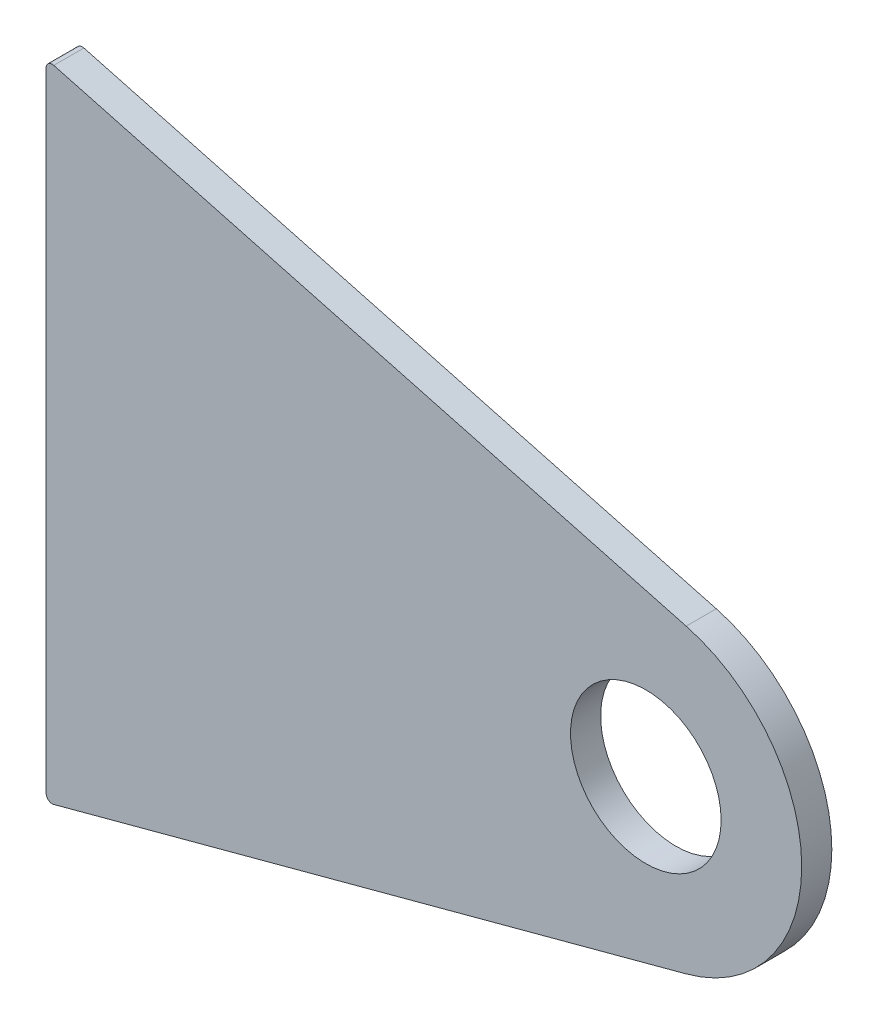
ISO-10303-21;
HEADER;
FILE_DESCRIPTION(('STEP AP214'),'2;1');
FILE_NAME('part.step','',(''),(''),'','','');
FILE_SCHEMA(('AUTOMOTIVE_DESIGN { 1 0 10303 214 1 1 1 1 }'));
ENDSEC;
DATA;
#1=APPLICATION_CONTEXT('core data for automotive mechanical design processes');
#2=APPLICATION_PROTOCOL_DEFINITION('international standard','automotive_design',2000,#1);
#3=PRODUCT_CONTEXT('',#1,'mechanical');
#4=PRODUCT('Part','Part','',(#3));
#5=PRODUCT_RELATED_PRODUCT_CATEGORY('part','',(#4));
#6=PRODUCT_DEFINITION_FORMATION('','',#4);
#7=PRODUCT_DEFINITION_CONTEXT('part definition',#1,'design');
#8=PRODUCT_DEFINITION('design','',#6,#7);
#9=PRODUCT_DEFINITION_SHAPE('','',#8);
#10=(LENGTH_UNIT() NAMED_UNIT(*) SI_UNIT(.MILLI.,.METRE.));
#11=(NAMED_UNIT(*) PLANE_ANGLE_UNIT() SI_UNIT($,.RADIAN.));
#12=(NAMED_UNIT(*) SI_UNIT($,.STERADIAN.) SOLID_ANGLE_UNIT());
#13=UNCERTAINTY_MEASURE_WITH_UNIT(LENGTH_MEASURE(1.E-05),#10,'distance_accuracy_value','');
#14=(GEOMETRIC_REPRESENTATION_CONTEXT(3) GLOBAL_UNCERTAINTY_ASSIGNED_CONTEXT((#13)) GLOBAL_UNIT_ASSIGNED_CONTEXT((#10,
#11,#12)) REPRESENTATION_CONTEXT('',''));
#15=CARTESIAN_POINT('',(0.,0.,0.));
#16=DIRECTION('',(0.,0.,1.));
#17=DIRECTION('',(1.,0.,0.));
#18=AXIS2_PLACEMENT_3D('',#15,#16,#17);
#19=CARTESIAN_POINT('',(13.3974596215562,49.9999999999999,10.));
#20=DIRECTION('',(-0.258819045102523,-0.965925826289068,0.));
#21=DIRECTION('',(0.965925826289068,-0.258819045102523,0.));
#22=AXIS2_PLACEMENT_3D('',#19,#20,#21);
#23=PLANE('',#22);
#24=DIRECTION('',(-0.965925826289068,0.258819045102523,0.));
#25=VECTOR('',#24,1.);
#26=CARTESIAN_POINT('',(13.3974596215562,49.9999999999999,0.));
#27=LINE('',#26,#25);
#28=CARTESIAN_POINT('',(13.3974596215558,50.,0.));
#29=VERTEX_POINT('',#28);
#30=CARTESIAN_POINT('',(-196.588584071834,106.265590829451,0.));
#31=VERTEX_POINT('',#30);
#32=EDGE_CURVE('E124',#29,#31,#27,.T.);
#33=ORIENTED_EDGE('',*,*,#32,.T.);
#34=DIRECTION('',(0.,0.,-1.));
#35=VECTOR('',#34,1.);
#36=CARTESIAN_POINT('',(-196.588584071834,106.265590829451,10.));
#37=LINE('',#36,#35);
#38=CARTESIAN_POINT('',(-196.588584071834,106.265590829451,10.));
#39=VERTEX_POINT('',#38);
#40=EDGE_CURVE('E11',#31,#39,#37,.F.);
#41=ORIENTED_EDGE('',*,*,#40,.T.);
#42=DIRECTION('',(-0.965925826289068,0.258819045102523,0.));
#43=VECTOR('',#42,1.);
#44=CARTESIAN_POINT('',(13.3974596215562,49.9999999999999,10.));
#45=LINE('',#44,#43);
#46=CARTESIAN_POINT('',(13.3974596215558,50.,10.));
#47=VERTEX_POINT('',#46);
#48=EDGE_CURVE('E143',#47,#39,#45,.T.);
#49=ORIENTED_EDGE('',*,*,#48,.F.);
#50=DIRECTION('',(0.,0.,-1.));
#51=VECTOR('',#50,1.);
#52=CARTESIAN_POINT('',(13.3974596215558,50.,10.));
#53=LINE('',#52,#51);
#54=EDGE_CURVE('E107',#47,#29,#53,.T.);
#55=ORIENTED_EDGE('',*,*,#54,.T.);
#56=EDGE_LOOP('',(#33,#41,#49,#55));
#57=FACE_BOUND('',#56,.T.);
#58=ADVANCED_FACE('F39',(#57),#23,.F.);
#59=CARTESIAN_POINT('',(-199.106222162039,0.,10.));
#60=DIRECTION('',(1.,0.,0.));
#61=DIRECTION('',(0.,1.,0.));
#62=AXIS2_PLACEMENT_3D('',#59,#60,#61);
#63=PLANE('',#62);
#64=DIRECTION('',(0.,-1.,0.));
#65=VECTOR('',#64,1.);
#66=CARTESIAN_POINT('',(-199.106222162039,0.,0.));
#67=LINE('',#66,#65);
#68=CARTESIAN_POINT('',(-199.106222162039,104.333739176873,0.));
#69=VERTEX_POINT('',#68);
#70=CARTESIAN_POINT('',(-199.106222162039,-104.333739176872,0.));
#71=VERTEX_POINT('',#70);
#72=EDGE_CURVE('E126',#69,#71,#67,.T.);
#73=ORIENTED_EDGE('',*,*,#72,.T.);
#74=DIRECTION('',(0.,0.,-1.));
#75=VECTOR('',#74,1.);
#76=CARTESIAN_POINT('',(-199.106222162039,-104.333739176872,10.));
#77=LINE('',#76,#75);
#78=CARTESIAN_POINT('',(-199.106222162039,-104.333739176872,10.));
#79=VERTEX_POINT('',#78);
#80=EDGE_CURVE('E60',#71,#79,#77,.F.);
#81=ORIENTED_EDGE('',*,*,#80,.T.);
#82=DIRECTION('',(0.,-1.,0.));
#83=VECTOR('',#82,1.);
#84=CARTESIAN_POINT('',(-199.106222162039,0.,10.));
#85=LINE('',#84,#83);
#86=CARTESIAN_POINT('',(-199.106222162039,104.333739176873,10.));
#87=VERTEX_POINT('',#86);
#88=EDGE_CURVE('E114',#87,#79,#85,.T.);
#89=ORIENTED_EDGE('',*,*,#88,.F.);
#90=DIRECTION('',(0.,0.,-1.));
#91=VECTOR('',#90,1.);
#92=CARTESIAN_POINT('',(-199.106222162039,104.333739176873,10.));
#93=LINE('',#92,#91);
#94=EDGE_CURVE('E137',#87,#69,#93,.T.);
#95=ORIENTED_EDGE('',*,*,#94,.T.);
#96=EDGE_LOOP('',(#73,#81,#89,#95));
#97=FACE_BOUND('',#96,.T.);
#98=ADVANCED_FACE('F146',(#97),#63,.F.);
#99=CARTESIAN_POINT('',(13.3974596215562,-49.9999999999999,10.));
#100=DIRECTION('',(0.258819045102522,-0.965925826289068,0.));
#101=DIRECTION('',(0.965925826289068,0.258819045102522,0.));
#102=AXIS2_PLACEMENT_3D('',#99,#100,#101);
#103=PLANE('',#102);
#104=DIRECTION('',(-0.965925826289068,-0.258819045102522,0.));
#105=VECTOR('',#104,1.);
#106=CARTESIAN_POINT('',(13.3974596215562,-49.9999999999999,10.));
#107=LINE('',#106,#105);
#108=CARTESIAN_POINT('',(13.3974596215558,-50.,10.));
#109=VERTEX_POINT('',#108);
#110=CARTESIAN_POINT('',(-196.588584071834,-106.265590829451,10.));
#111=VERTEX_POINT('',#110);
#112=EDGE_CURVE('E98',#109,#111,#107,.T.);
#113=ORIENTED_EDGE('',*,*,#112,.T.);
#114=DIRECTION('',(0.,0.,-1.));
#115=VECTOR('',#114,1.);
#116=CARTESIAN_POINT('',(-196.588584071834,-106.265590829451,0.));
#117=LINE('',#116,#115);
#118=CARTESIAN_POINT('',(-196.588584071834,-106.265590829451,0.));
#119=VERTEX_POINT('',#118);
#120=EDGE_CURVE('E106',#111,#119,#117,.T.);
#121=ORIENTED_EDGE('',*,*,#120,.T.);
#122=DIRECTION('',(-0.965925826289068,-0.258819045102522,0.));
#123=VECTOR('',#122,1.);
#124=CARTESIAN_POINT('',(13.3974596215562,-49.9999999999999,0.));
#125=LINE('',#124,#123);
#126=CARTESIAN_POINT('',(13.3974596215558,-50.,0.));
#127=VERTEX_POINT('',#126);
#128=EDGE_CURVE('E101',#127,#119,#125,.T.);
#129=ORIENTED_EDGE('',*,*,#128,.F.);
#130=DIRECTION('',(0.,0.,-1.));
#131=VECTOR('',#130,1.);
#132=CARTESIAN_POINT('',(13.3974596215558,-50.,10.));
#133=LINE('',#132,#131);
#134=EDGE_CURVE('E94',#109,#127,#133,.T.);
#135=ORIENTED_EDGE('',*,*,#134,.F.);
#136=EDGE_LOOP('',(#113,#121,#129,#135));
#137=FACE_BOUND('',#136,.T.);
#138=ADVANCED_FACE('F96',(#137),#103,.T.);
#139=CARTESIAN_POINT('',(0.,0.,10.));
#140=DIRECTION('',(0.,0.,-1.));
#141=DIRECTION('',(-1.,0.,0.));
#142=AXIS2_PLACEMENT_3D('',#139,#140,#141);
#143=CYLINDRICAL_SURFACE('',#142,25.);
#144=CARTESIAN_POINT('',(0.,0.,10.));
#145=DIRECTION('',(0.,0.,1.));
#146=DIRECTION('',(1.,0.,0.));
#147=AXIS2_PLACEMENT_3D('',#144,#145,#146);
#148=CIRCLE('',#147,25.);
#149=CARTESIAN_POINT('',(25.,0.,10.));
#150=VERTEX_POINT('',#149);
#151=EDGE_CURVE('E130',#150,#150,#148,.T.);
#152=ORIENTED_EDGE('',*,*,#151,.T.);
#153=EDGE_LOOP('',(#152));
#154=FACE_BOUND('',#153,.T.);
#155=CARTESIAN_POINT('',(0.,0.,0.));
#156=DIRECTION('',(0.,0.,1.));
#157=DIRECTION('',(1.,0.,0.));
#158=AXIS2_PLACEMENT_3D('',#155,#156,#157);
#159=CIRCLE('',#158,25.);
#160=CARTESIAN_POINT('',(25.,0.,0.));
#161=VERTEX_POINT('',#160);
#162=EDGE_CURVE('E121',#161,#161,#159,.T.);
#163=ORIENTED_EDGE('',*,*,#162,.F.);
#164=EDGE_LOOP('',(#163));
#165=FACE_BOUND('',#164,.T.);
#166=ADVANCED_FACE('F156',(#154,#165),#143,.F.);
#167=CARTESIAN_POINT('',(0.,0.,10.));
#168=DIRECTION('',(0.,0.,-1.));
#169=DIRECTION('',(-1.,0.,0.));
#170=AXIS2_PLACEMENT_3D('',#167,#168,#169);
#171=CYLINDRICAL_SURFACE('',#170,51.7638090205041);
#172=CARTESIAN_POINT('',(0.,0.,0.));
#173=DIRECTION('',(0.,0.,1.));
#174=DIRECTION('',(1.,0.,0.));
#175=AXIS2_PLACEMENT_3D('',#172,#173,#174);
#176=CIRCLE('',#175,51.7638090205041);
#177=EDGE_CURVE('E129',#29,#127,#176,.F.);
#178=ORIENTED_EDGE('',*,*,#177,.F.);
#179=ORIENTED_EDGE('',*,*,#54,.F.);
#180=CARTESIAN_POINT('',(0.,0.,10.));
#181=DIRECTION('',(0.,0.,1.));
#182=DIRECTION('',(1.,0.,0.));
#183=AXIS2_PLACEMENT_3D('',#180,#181,#182);
#184=CIRCLE('',#183,51.7638090205041);
#185=EDGE_CURVE('E112',#47,#109,#184,.F.);
#186=ORIENTED_EDGE('',*,*,#185,.T.);
#187=ORIENTED_EDGE('',*,*,#134,.T.);
#188=EDGE_LOOP('',(#178,#179,#186,#187));
#189=FACE_BOUND('',#188,.T.);
#190=ADVANCED_FACE('F116',(#189),#171,.T.);
#191=CARTESIAN_POINT('',(0.,0.,10.));
#192=DIRECTION('',(0.,0.,1.));
#193=DIRECTION('',(1.,0.,0.));
#194=AXIS2_PLACEMENT_3D('',#191,#192,#193);
#195=PLANE('',#194);
#196=ORIENTED_EDGE('',*,*,#151,.F.);
#197=EDGE_LOOP('',(#196));
#198=FACE_BOUND('',#197,.T.);
#199=ORIENTED_EDGE('',*,*,#88,.T.);
#200=CARTESIAN_POINT('',(-197.106222162039,-104.333739176872,10.));
#201=DIRECTION('',(0.,0.,1.));
#202=DIRECTION('',(1.,0.,0.));
#203=AXIS2_PLACEMENT_3D('',#200,#201,#202);
#204=CIRCLE('',#203,2.);
#205=EDGE_CURVE('E47',#79,#111,#204,.T.);
#206=ORIENTED_EDGE('',*,*,#205,.T.);
#207=ORIENTED_EDGE('',*,*,#112,.F.);
#208=ORIENTED_EDGE('',*,*,#185,.F.);
#209=ORIENTED_EDGE('',*,*,#48,.T.);
#210=CARTESIAN_POINT('',(-197.106222162039,104.333739176873,10.));
#211=DIRECTION('',(0.,0.,1.));
#212=DIRECTION('',(1.,0.,0.));
#213=AXIS2_PLACEMENT_3D('',#210,#211,#212);
#214=CIRCLE('',#213,2.);
#215=EDGE_CURVE('E141',#39,#87,#214,.T.);
#216=ORIENTED_EDGE('',*,*,#215,.T.);
#217=EDGE_LOOP('',(#199,#206,#207,#208,#209,#216));
#218=FACE_BOUND('',#217,.T.);
#219=ADVANCED_FACE('F111',(#198,#218),#195,.T.);
#220=CARTESIAN_POINT('',(0.,0.,0.));
#221=DIRECTION('',(0.,0.,1.));
#222=DIRECTION('',(1.,0.,0.));
#223=AXIS2_PLACEMENT_3D('',#220,#221,#222);
#224=PLANE('',#223);
#225=ORIENTED_EDGE('',*,*,#162,.T.);
#226=EDGE_LOOP('',(#225));
#227=FACE_BOUND('',#226,.T.);
#228=ORIENTED_EDGE('',*,*,#128,.T.);
#229=CARTESIAN_POINT('',(-197.106222162039,-104.333739176872,0.));
#230=DIRECTION('',(0.,0.,1.));
#231=DIRECTION('',(1.,0.,0.));
#232=AXIS2_PLACEMENT_3D('',#229,#230,#231);
#233=CIRCLE('',#232,2.);
#234=EDGE_CURVE('E135',#119,#71,#233,.F.);
#235=ORIENTED_EDGE('',*,*,#234,.T.);
#236=ORIENTED_EDGE('',*,*,#72,.F.);
#237=CARTESIAN_POINT('',(-197.106222162039,104.333739176873,0.));
#238=DIRECTION('',(0.,0.,1.));
#239=DIRECTION('',(1.,0.,0.));
#240=AXIS2_PLACEMENT_3D('',#237,#238,#239);
#241=CIRCLE('',#240,2.);
#242=EDGE_CURVE('E133',#69,#31,#241,.F.);
#243=ORIENTED_EDGE('',*,*,#242,.T.);
#244=ORIENTED_EDGE('',*,*,#32,.F.);
#245=ORIENTED_EDGE('',*,*,#177,.T.);
#246=EDGE_LOOP('',(#228,#235,#236,#243,#244,#245));
#247=FACE_BOUND('',#246,.T.);
#248=ADVANCED_FACE('F150',(#227,#247),#224,.F.);
#249=CARTESIAN_POINT('',(-197.106222162039,-104.333739176872,10.));
#250=DIRECTION('',(0.,0.,1.));
#251=DIRECTION('',(1.,0.,0.));
#252=AXIS2_PLACEMENT_3D('',#249,#250,#251);
#253=CYLINDRICAL_SURFACE('',#252,2.);
#254=ORIENTED_EDGE('',*,*,#205,.F.);
#255=ORIENTED_EDGE('',*,*,#80,.F.);
#256=ORIENTED_EDGE('',*,*,#234,.F.);
#257=ORIENTED_EDGE('',*,*,#120,.F.);
#258=EDGE_LOOP('',(#254,#255,#256,#257));
#259=FACE_BOUND('',#258,.T.);
#260=ADVANCED_FACE('F165',(#259),#253,.T.);
#261=CARTESIAN_POINT('',(-197.106222162039,104.333739176873,10.));
#262=DIRECTION('',(0.,0.,-1.));
#263=DIRECTION('',(-1.,0.,0.));
#264=AXIS2_PLACEMENT_3D('',#261,#262,#263);
#265=CYLINDRICAL_SURFACE('',#264,2.);
#266=ORIENTED_EDGE('',*,*,#215,.F.);
#267=ORIENTED_EDGE('',*,*,#40,.F.);
#268=ORIENTED_EDGE('',*,*,#242,.F.);
#269=ORIENTED_EDGE('',*,*,#94,.F.);
#270=EDGE_LOOP('',(#266,#267,#268,#269));
#271=FACE_BOUND('',#270,.T.);
#272=ADVANCED_FACE('F41',(#271),#265,.T.);
#273=CLOSED_SHELL('',(#58,#98,#138,#166,#190,#219,#248,#260,#272));
#274=MANIFOLD_SOLID_BREP('B2',#273);
#275=ADVANCED_BREP_SHAPE_REPRESENTATION('',(#18,#274),#14);
#276=SHAPE_DEFINITION_REPRESENTATION(#9,#275);
ENDSEC;
END-ISO-10303-21;
